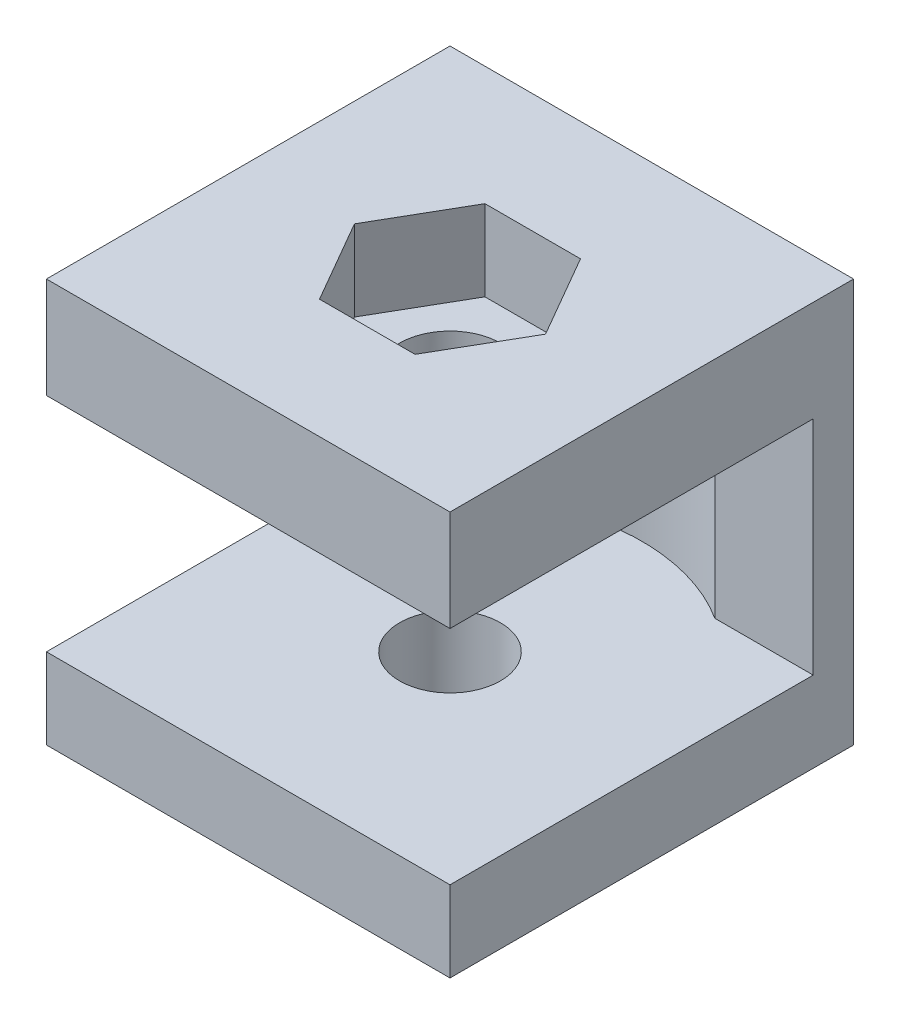
ISO-10303-21;
HEADER;
FILE_DESCRIPTION(('STEP AP214'),'2;1');
FILE_NAME('part.step','',(''),(''),'','','');
FILE_SCHEMA(('AUTOMOTIVE_DESIGN { 1 0 10303 214 1 1 1 1 }'));
ENDSEC;
DATA;
#1=APPLICATION_CONTEXT('core data for automotive mechanical design processes');
#2=APPLICATION_PROTOCOL_DEFINITION('international standard','automotive_design',2000,#1);
#3=PRODUCT_CONTEXT('',#1,'mechanical');
#4=PRODUCT('Part','Part','',(#3));
#5=PRODUCT_RELATED_PRODUCT_CATEGORY('part','',(#4));
#6=PRODUCT_DEFINITION_FORMATION('','',#4);
#7=PRODUCT_DEFINITION_CONTEXT('part definition',#1,'design');
#8=PRODUCT_DEFINITION('design','',#6,#7);
#9=PRODUCT_DEFINITION_SHAPE('','',#8);
#10=(LENGTH_UNIT() NAMED_UNIT(*) SI_UNIT(.MILLI.,.METRE.));
#11=(NAMED_UNIT(*) PLANE_ANGLE_UNIT() SI_UNIT($,.RADIAN.));
#12=(NAMED_UNIT(*) SI_UNIT($,.STERADIAN.) SOLID_ANGLE_UNIT());
#13=UNCERTAINTY_MEASURE_WITH_UNIT(LENGTH_MEASURE(1.E-05),#10,'distance_accuracy_value','');
#14=(GEOMETRIC_REPRESENTATION_CONTEXT(3) GLOBAL_UNCERTAINTY_ASSIGNED_CONTEXT((#13)) GLOBAL_UNIT_ASSIGNED_CONTEXT((#10,
#11,#12)) REPRESENTATION_CONTEXT('',''));
#15=CARTESIAN_POINT('',(0.,0.,0.));
#16=DIRECTION('',(0.,0.,1.));
#17=DIRECTION('',(1.,0.,0.));
#18=AXIS2_PLACEMENT_3D('',#15,#16,#17);
#19=CARTESIAN_POINT('',(0.,0.,2.));
#20=DIRECTION('',(0.,0.,-1.));
#21=DIRECTION('',(-1.,0.,0.));
#22=AXIS2_PLACEMENT_3D('',#19,#20,#21);
#23=PLANE('',#22);
#24=DIRECTION('',(1.,0.,0.));
#25=VECTOR('',#24,1.);
#26=CARTESIAN_POINT('',(-10.,5.,2.));
#27=LINE('',#26,#25);
#28=CARTESIAN_POINT('',(5.1234753829798,5.,2.));
#29=VERTEX_POINT('',#28);
#30=CARTESIAN_POINT('',(10.,5.,2.));
#31=VERTEX_POINT('',#30);
#32=EDGE_CURVE('E160',#29,#31,#27,.T.);
#33=ORIENTED_EDGE('',*,*,#32,.F.);
#34=DIRECTION('',(0.,-1.,0.));
#35=VECTOR('',#34,1.);
#36=CARTESIAN_POINT('',(5.1234753829798,5.,2.));
#37=LINE('',#36,#35);
#38=CARTESIAN_POINT('',(5.1234753829798,-6.,2.));
#39=VERTEX_POINT('',#38);
#40=EDGE_CURVE('E148',#29,#39,#37,.T.);
#41=ORIENTED_EDGE('',*,*,#40,.T.);
#42=DIRECTION('',(-1.,0.,0.));
#43=VECTOR('',#42,1.);
#44=CARTESIAN_POINT('',(10.,-6.,2.));
#45=LINE('',#44,#43);
#46=CARTESIAN_POINT('',(10.,-6.,2.));
#47=VERTEX_POINT('',#46);
#48=EDGE_CURVE('E158',#47,#39,#45,.T.);
#49=ORIENTED_EDGE('',*,*,#48,.F.);
#50=DIRECTION('',(0.,1.,0.));
#51=VECTOR('',#50,1.);
#52=CARTESIAN_POINT('',(10.,-10.,2.));
#53=LINE('',#52,#51);
#54=EDGE_CURVE('E206',#47,#31,#53,.T.);
#55=ORIENTED_EDGE('',*,*,#54,.T.);
#56=EDGE_LOOP('',(#33,#41,#49,#55));
#57=FACE_BOUND('',#56,.T.);
#58=ADVANCED_FACE('F33',(#57),#23,.F.);
#59=CARTESIAN_POINT('',(0.,-10.,10.));
#60=DIRECTION('',(0.,1.,0.));
#61=DIRECTION('',(0.,0.,1.));
#62=AXIS2_PLACEMENT_3D('',#59,#60,#61);
#63=CYLINDRICAL_SURFACE('',#62,2.5);
#64=CARTESIAN_POINT('',(0.,5.,10.));
#65=DIRECTION('',(0.,1.,0.));
#66=DIRECTION('',(-1.,0.,0.));
#67=AXIS2_PLACEMENT_3D('',#64,#65,#66);
#68=CIRCLE('',#67,2.5);
#69=CARTESIAN_POINT('',(-2.5,5.,10.));
#70=VERTEX_POINT('',#69);
#71=EDGE_CURVE('E173',#70,#70,#68,.T.);
#72=ORIENTED_EDGE('',*,*,#71,.F.);
#73=EDGE_LOOP('',(#72));
#74=FACE_BOUND('',#73,.T.);
#75=CARTESIAN_POINT('',(0.,6.,10.));
#76=DIRECTION('',(0.,1.,0.));
#77=DIRECTION('',(0.,0.,1.));
#78=AXIS2_PLACEMENT_3D('',#75,#76,#77);
#79=CIRCLE('',#78,2.5);
#80=CARTESIAN_POINT('',(0.,6.,12.5));
#81=VERTEX_POINT('',#80);
#82=EDGE_CURVE('E37',#81,#81,#79,.F.);
#83=ORIENTED_EDGE('',*,*,#82,.F.);
#84=EDGE_LOOP('',(#83));
#85=FACE_BOUND('',#84,.T.);
#86=ADVANCED_FACE('F304',(#74,#85),#63,.F.);
#87=CARTESIAN_POINT('',(-5.1234753829798,-6.,2.));
#88=VERTEX_POINT('',#87);
#89=CARTESIAN_POINT('',(-10.,-6.,2.));
#90=VERTEX_POINT('',#89);
#91=EDGE_CURVE('E168',#88,#90,#45,.T.);
#92=ORIENTED_EDGE('',*,*,#91,.F.);
#93=DIRECTION('',(0.,-1.,0.));
#94=VECTOR('',#93,1.);
#95=CARTESIAN_POINT('',(-5.1234753829798,5.,2.));
#96=LINE('',#95,#94);
#97=CARTESIAN_POINT('',(-5.1234753829798,5.,2.));
#98=VERTEX_POINT('',#97);
#99=EDGE_CURVE('E151',#88,#98,#96,.F.);
#100=ORIENTED_EDGE('',*,*,#99,.T.);
#101=CARTESIAN_POINT('',(-10.,5.,2.));
#102=VERTEX_POINT('',#101);
#103=EDGE_CURVE('E186',#102,#98,#27,.T.);
#104=ORIENTED_EDGE('',*,*,#103,.F.);
#105=DIRECTION('',(0.,-1.,0.));
#106=VECTOR('',#105,1.);
#107=CARTESIAN_POINT('',(-10.,-10.,2.));
#108=LINE('',#107,#106);
#109=EDGE_CURVE('E208',#102,#90,#108,.T.);
#110=ORIENTED_EDGE('',*,*,#109,.T.);
#111=EDGE_LOOP('',(#92,#100,#104,#110));
#112=FACE_BOUND('',#111,.T.);
#113=ADVANCED_FACE('F307',(#112),#23,.F.);
#114=CARTESIAN_POINT('',(10.,-10.,2.));
#115=DIRECTION('',(-1.,0.,0.));
#116=DIRECTION('',(0.,0.,1.));
#117=AXIS2_PLACEMENT_3D('',#114,#115,#116);
#118=PLANE('',#117);
#119=DIRECTION('',(0.,1.,0.));
#120=VECTOR('',#119,1.);
#121=CARTESIAN_POINT('',(10.,-10.,0.));
#122=LINE('',#121,#120);
#123=CARTESIAN_POINT('',(10.,-10.,0.));
#124=VERTEX_POINT('',#123);
#125=CARTESIAN_POINT('',(10.,10.,0.));
#126=VERTEX_POINT('',#125);
#127=EDGE_CURVE('E205',#124,#126,#122,.T.);
#128=ORIENTED_EDGE('',*,*,#127,.T.);
#129=DIRECTION('',(0.,0.,-1.));
#130=VECTOR('',#129,1.);
#131=CARTESIAN_POINT('',(10.,10.,2.));
#132=LINE('',#131,#130);
#133=CARTESIAN_POINT('',(10.,10.,20.));
#134=VERTEX_POINT('',#133);
#135=EDGE_CURVE('E11',#134,#126,#132,.T.);
#136=ORIENTED_EDGE('',*,*,#135,.F.);
#137=DIRECTION('',(0.,1.,0.));
#138=VECTOR('',#137,1.);
#139=CARTESIAN_POINT('',(10.,10.,20.));
#140=LINE('',#139,#138);
#141=CARTESIAN_POINT('',(10.,5.,20.));
#142=VERTEX_POINT('',#141);
#143=EDGE_CURVE('E188',#142,#134,#140,.T.);
#144=ORIENTED_EDGE('',*,*,#143,.F.);
#145=DIRECTION('',(0.,0.,-1.));
#146=VECTOR('',#145,1.);
#147=CARTESIAN_POINT('',(10.,5.,20.));
#148=LINE('',#147,#146);
#149=EDGE_CURVE('E194',#142,#31,#148,.T.);
#150=ORIENTED_EDGE('',*,*,#149,.T.);
#151=ORIENTED_EDGE('',*,*,#54,.F.);
#152=DIRECTION('',(0.,0.,-1.));
#153=VECTOR('',#152,1.);
#154=CARTESIAN_POINT('',(10.,-6.,20.));
#155=LINE('',#154,#153);
#156=CARTESIAN_POINT('',(10.,-6.,20.));
#157=VERTEX_POINT('',#156);
#158=EDGE_CURVE('E166',#157,#47,#155,.T.);
#159=ORIENTED_EDGE('',*,*,#158,.F.);
#160=DIRECTION('',(0.,1.,0.));
#161=VECTOR('',#160,1.);
#162=CARTESIAN_POINT('',(10.,-10.,20.));
#163=LINE('',#162,#161);
#164=CARTESIAN_POINT('',(10.,-10.,20.));
#165=VERTEX_POINT('',#164);
#166=EDGE_CURVE('E167',#165,#157,#163,.T.);
#167=ORIENTED_EDGE('',*,*,#166,.F.);
#168=DIRECTION('',(0.,0.,-1.));
#169=VECTOR('',#168,1.);
#170=CARTESIAN_POINT('',(10.,-10.,2.));
#171=LINE('',#170,#169);
#172=EDGE_CURVE('E212',#165,#124,#171,.T.);
#173=ORIENTED_EDGE('',*,*,#172,.T.);
#174=EDGE_LOOP('',(#128,#136,#144,#150,#151,#159,#167,#173));
#175=FACE_BOUND('',#174,.T.);
#176=ADVANCED_FACE('F35',(#175),#118,.F.);
#177=CARTESIAN_POINT('',(-10.,10.,2.));
#178=DIRECTION('',(0.,-1.,0.));
#179=DIRECTION('',(0.,0.,-1.));
#180=AXIS2_PLACEMENT_3D('',#177,#178,#179);
#181=PLANE('',#180);
#182=DIRECTION('',(-0.5,0.,-0.866025403784439));
#183=VECTOR('',#182,1.);
#184=CARTESIAN_POINT('',(4.73427220735493,10.,10.));
#185=LINE('',#184,#183);
#186=CARTESIAN_POINT('',(4.73427220735493,10.,10.));
#187=VERTEX_POINT('',#186);
#188=CARTESIAN_POINT('',(2.36713610367747,10.,5.9));
#189=VERTEX_POINT('',#188);
#190=EDGE_CURVE('E510',#187,#189,#185,.T.);
#191=ORIENTED_EDGE('',*,*,#190,.F.);
#192=DIRECTION('',(0.5,0.,-0.866025403784439));
#193=VECTOR('',#192,1.);
#194=CARTESIAN_POINT('',(2.36713610367747,10.,14.1));
#195=LINE('',#194,#193);
#196=CARTESIAN_POINT('',(2.36713610367747,10.,14.1));
#197=VERTEX_POINT('',#196);
#198=EDGE_CURVE('E58',#197,#187,#195,.T.);
#199=ORIENTED_EDGE('',*,*,#198,.F.);
#200=DIRECTION('',(1.,0.,0.));
#201=VECTOR('',#200,1.);
#202=CARTESIAN_POINT('',(-2.36713610367746,10.,14.1));
#203=LINE('',#202,#201);
#204=CARTESIAN_POINT('',(-2.36713610367746,10.,14.1));
#205=VERTEX_POINT('',#204);
#206=EDGE_CURVE('E526',#205,#197,#203,.T.);
#207=ORIENTED_EDGE('',*,*,#206,.F.);
#208=DIRECTION('',(0.5,0.,0.866025403784439));
#209=VECTOR('',#208,1.);
#210=CARTESIAN_POINT('',(-4.73427220735493,10.,10.));
#211=LINE('',#210,#209);
#212=CARTESIAN_POINT('',(-4.73427220735493,10.,10.));
#213=VERTEX_POINT('',#212);
#214=EDGE_CURVE('E523',#213,#205,#211,.T.);
#215=ORIENTED_EDGE('',*,*,#214,.F.);
#216=DIRECTION('',(-0.5,0.,0.866025403784439));
#217=VECTOR('',#216,1.);
#218=CARTESIAN_POINT('',(-2.36713610367746,10.,5.9));
#219=LINE('',#218,#217);
#220=CARTESIAN_POINT('',(-2.36713610367746,10.,5.9));
#221=VERTEX_POINT('',#220);
#222=EDGE_CURVE('E516',#221,#213,#219,.T.);
#223=ORIENTED_EDGE('',*,*,#222,.F.);
#224=DIRECTION('',(-1.,0.,0.));
#225=VECTOR('',#224,1.);
#226=CARTESIAN_POINT('',(2.36713610367747,10.,5.9));
#227=LINE('',#226,#225);
#228=EDGE_CURVE('E514',#189,#221,#227,.T.);
#229=ORIENTED_EDGE('',*,*,#228,.F.);
#230=EDGE_LOOP('',(#191,#199,#207,#215,#223,#229));
#231=FACE_BOUND('',#230,.T.);
#232=DIRECTION('',(-1.,0.,0.));
#233=VECTOR('',#232,1.);
#234=CARTESIAN_POINT('',(-10.,10.,0.));
#235=LINE('',#234,#233);
#236=CARTESIAN_POINT('',(-10.,10.,0.));
#237=VERTEX_POINT('',#236);
#238=EDGE_CURVE('E215',#126,#237,#235,.T.);
#239=ORIENTED_EDGE('',*,*,#238,.T.);
#240=DIRECTION('',(0.,0.,-1.));
#241=VECTOR('',#240,1.);
#242=CARTESIAN_POINT('',(-10.,10.,2.));
#243=LINE('',#242,#241);
#244=CARTESIAN_POINT('',(-10.,10.,20.));
#245=VERTEX_POINT('',#244);
#246=EDGE_CURVE('E42',#245,#237,#243,.T.);
#247=ORIENTED_EDGE('',*,*,#246,.F.);
#248=DIRECTION('',(-1.,0.,0.));
#249=VECTOR('',#248,1.);
#250=CARTESIAN_POINT('',(-10.,10.,20.));
#251=LINE('',#250,#249);
#252=EDGE_CURVE('E191',#134,#245,#251,.T.);
#253=ORIENTED_EDGE('',*,*,#252,.F.);
#254=ORIENTED_EDGE('',*,*,#135,.T.);
#255=EDGE_LOOP('',(#239,#247,#253,#254));
#256=FACE_BOUND('',#255,.T.);
#257=ADVANCED_FACE('F331',(#231,#256),#181,.F.);
#258=CARTESIAN_POINT('',(-10.,-10.,2.));
#259=DIRECTION('',(1.,0.,0.));
#260=DIRECTION('',(0.,0.,-1.));
#261=AXIS2_PLACEMENT_3D('',#258,#259,#260);
#262=PLANE('',#261);
#263=DIRECTION('',(0.,-1.,0.));
#264=VECTOR('',#263,1.);
#265=CARTESIAN_POINT('',(-10.,-10.,0.));
#266=LINE('',#265,#264);
#267=CARTESIAN_POINT('',(-10.,-10.,0.));
#268=VERTEX_POINT('',#267);
#269=EDGE_CURVE('E217',#237,#268,#266,.T.);
#270=ORIENTED_EDGE('',*,*,#269,.T.);
#271=DIRECTION('',(0.,0.,-1.));
#272=VECTOR('',#271,1.);
#273=CARTESIAN_POINT('',(-10.,-10.,2.));
#274=LINE('',#273,#272);
#275=CARTESIAN_POINT('',(-10.,-10.,20.));
#276=VERTEX_POINT('',#275);
#277=EDGE_CURVE('E222',#276,#268,#274,.T.);
#278=ORIENTED_EDGE('',*,*,#277,.F.);
#279=DIRECTION('',(0.,-1.,0.));
#280=VECTOR('',#279,1.);
#281=CARTESIAN_POINT('',(-10.,-10.,20.));
#282=LINE('',#281,#280);
#283=CARTESIAN_POINT('',(-10.,-6.,20.));
#284=VERTEX_POINT('',#283);
#285=EDGE_CURVE('E242',#284,#276,#282,.T.);
#286=ORIENTED_EDGE('',*,*,#285,.F.);
#287=DIRECTION('',(0.,0.,-1.));
#288=VECTOR('',#287,1.);
#289=CARTESIAN_POINT('',(-10.,-6.,20.));
#290=LINE('',#289,#288);
#291=EDGE_CURVE('E178',#284,#90,#290,.T.);
#292=ORIENTED_EDGE('',*,*,#291,.T.);
#293=ORIENTED_EDGE('',*,*,#109,.F.);
#294=DIRECTION('',(0.,0.,-1.));
#295=VECTOR('',#294,1.);
#296=CARTESIAN_POINT('',(-10.,5.,20.));
#297=LINE('',#296,#295);
#298=CARTESIAN_POINT('',(-10.,5.,20.));
#299=VERTEX_POINT('',#298);
#300=EDGE_CURVE('E199',#299,#102,#297,.T.);
#301=ORIENTED_EDGE('',*,*,#300,.F.);
#302=DIRECTION('',(0.,-1.,0.));
#303=VECTOR('',#302,1.);
#304=CARTESIAN_POINT('',(-10.,10.,20.));
#305=LINE('',#304,#303);
#306=EDGE_CURVE('E182',#245,#299,#305,.T.);
#307=ORIENTED_EDGE('',*,*,#306,.F.);
#308=ORIENTED_EDGE('',*,*,#246,.T.);
#309=EDGE_LOOP('',(#270,#278,#286,#292,#293,#301,#307,#308));
#310=FACE_BOUND('',#309,.T.);
#311=ADVANCED_FACE('F335',(#310),#262,.F.);
#312=CARTESIAN_POINT('',(-10.,-10.,2.));
#313=DIRECTION('',(0.,1.,0.));
#314=DIRECTION('',(0.,0.,1.));
#315=AXIS2_PLACEMENT_3D('',#312,#313,#314);
#316=PLANE('',#315);
#317=CARTESIAN_POINT('',(0.,-10.,10.));
#318=DIRECTION('',(0.,1.,0.));
#319=DIRECTION('',(0.,0.,1.));
#320=AXIS2_PLACEMENT_3D('',#317,#318,#319);
#321=CIRCLE('',#320,2.5);
#322=CARTESIAN_POINT('',(0.,-10.,12.5));
#323=VERTEX_POINT('',#322);
#324=EDGE_CURVE('E228',#323,#323,#321,.T.);
#325=ORIENTED_EDGE('',*,*,#324,.T.);
#326=EDGE_LOOP('',(#325));
#327=FACE_BOUND('',#326,.T.);
#328=DIRECTION('',(1.,0.,0.));
#329=VECTOR('',#328,1.);
#330=CARTESIAN_POINT('',(-10.,-10.,0.));
#331=LINE('',#330,#329);
#332=EDGE_CURVE('E209',#268,#124,#331,.T.);
#333=ORIENTED_EDGE('',*,*,#332,.T.);
#334=ORIENTED_EDGE('',*,*,#172,.F.);
#335=DIRECTION('',(1.,0.,0.));
#336=VECTOR('',#335,1.);
#337=CARTESIAN_POINT('',(10.,-10.,20.));
#338=LINE('',#337,#336);
#339=EDGE_CURVE('E176',#276,#165,#338,.T.);
#340=ORIENTED_EDGE('',*,*,#339,.F.);
#341=ORIENTED_EDGE('',*,*,#277,.T.);
#342=EDGE_LOOP('',(#333,#334,#340,#341));
#343=FACE_BOUND('',#342,.T.);
#344=ADVANCED_FACE('F338',(#327,#343),#316,.F.);
#345=CARTESIAN_POINT('',(0.,0.,0.));
#346=DIRECTION('',(0.,0.,-1.));
#347=DIRECTION('',(-1.,0.,0.));
#348=AXIS2_PLACEMENT_3D('',#345,#346,#347);
#349=PLANE('',#348);
#350=CARTESIAN_POINT('',(0.,0.,0.));
#351=DIRECTION('',(0.,0.,1.));
#352=DIRECTION('',(1.,0.,0.));
#353=AXIS2_PLACEMENT_3D('',#350,#351,#352);
#354=CIRCLE('',#353,1.75);
#355=CARTESIAN_POINT('',(1.75,0.,0.));
#356=VERTEX_POINT('',#355);
#357=EDGE_CURVE('E202',#356,#356,#354,.T.);
#358=ORIENTED_EDGE('',*,*,#357,.T.);
#359=EDGE_LOOP('',(#358));
#360=FACE_BOUND('',#359,.T.);
#361=ORIENTED_EDGE('',*,*,#127,.F.);
#362=ORIENTED_EDGE('',*,*,#332,.F.);
#363=ORIENTED_EDGE('',*,*,#269,.F.);
#364=ORIENTED_EDGE('',*,*,#238,.F.);
#365=EDGE_LOOP('',(#361,#362,#363,#364));
#366=FACE_BOUND('',#365,.T.);
#367=ADVANCED_FACE('F320',(#360,#366),#349,.T.);
#368=CARTESIAN_POINT('',(0.,0.,0.));
#369=DIRECTION('',(0.,0.,1.));
#370=DIRECTION('',(1.,0.,0.));
#371=AXIS2_PLACEMENT_3D('',#368,#369,#370);
#372=CYLINDRICAL_SURFACE('',#371,1.75);
#373=CARTESIAN_POINT('',(1.75,0.,0.66257530150845));
#374=CARTESIAN_POINT('',(1.74999623220849,0.0973992990408209,0.662573433377604));
#375=CARTESIAN_POINT('',(1.74184102840947,0.19484785294214,0.661034789893482));
#376=CARTESIAN_POINT('',(1.7094563799509,0.386999395994813,0.655053783929409));
#377=CARTESIAN_POINT('',(1.68521310323896,0.481699949305023,0.650608922817402));
#378=CARTESIAN_POINT('',(1.62142018446091,0.665547326706458,0.639335590529856));
#379=CARTESIAN_POINT('',(1.58188455731664,0.754699149424011,0.632509302411816));
#380=CARTESIAN_POINT('',(1.48866598605152,0.925098267008444,0.617244849503819));
#381=CARTESIAN_POINT('',(1.43498422601556,1.00634622267996,0.608806819639008));
#382=CARTESIAN_POINT('',(1.31430957437895,1.15961422830781,0.591156377114761));
#383=CARTESIAN_POINT('',(1.24717959692718,1.23152551318474,0.581936605460816));
#384=CARTESIAN_POINT('',(1.10181036515984,1.36313172007598,0.563826571966348));
#385=CARTESIAN_POINT('',(1.02357039415572,1.42282585337375,0.554936331430062));
#386=CARTESIAN_POINT('',(0.85748926558963,1.52871866655231,0.538408364963862));
#387=CARTESIAN_POINT('',(0.769581813216118,1.57481501027697,0.530780317566186));
#388=CARTESIAN_POINT('',(0.587106497676677,1.65154467633781,0.517718506249797));
#389=CARTESIAN_POINT('',(0.492539163717247,1.68217922572047,0.512284568213628));
#390=CARTESIAN_POINT('',(0.300555090734633,1.72677996183346,0.504275206993335));
#391=CARTESIAN_POINT('',(0.203182258196524,1.74092941143396,0.501668378154));
#392=CARTESIAN_POINT('',(0.00741218452522141,1.75272912668234,0.499498763447316));
#393=CARTESIAN_POINT('',(-0.0909849716179178,1.75038075046119,0.499935727009428));
#394=CARTESIAN_POINT('',(-0.284754386185304,1.72939241762022,0.503779868073802));
#395=CARTESIAN_POINT('',(-0.3801488332116,1.71094977235138,0.507151071293143));
#396=CARTESIAN_POINT('',(-0.56646549184599,1.65860825796605,0.516444598035701));
#397=CARTESIAN_POINT('',(-0.657387544566736,1.62470884016728,0.522367012121019));
#398=CARTESIAN_POINT('',(-0.832753181774179,1.54222672964522,0.536157835820039));
#399=CARTESIAN_POINT('',(-0.917158623417399,1.4935647621454,0.544036709087695));
#400=CARTESIAN_POINT('',(-1.07667964463152,1.38299724157549,0.560868452159825));
#401=CARTESIAN_POINT('',(-1.15179430998452,1.32109038683414,0.569821427486094));
#402=CARTESIAN_POINT('',(-1.29177008670047,1.18470191740536,0.587965475313633));
#403=CARTESIAN_POINT('',(-1.35646293273775,1.11004770502819,0.597158110464606));
#404=CARTESIAN_POINT('',(-1.47243448565902,0.950859715548552,0.614618466271964));
#405=CARTESIAN_POINT('',(-1.52371300951477,0.866325803667851,0.62288617430754));
#406=CARTESIAN_POINT('',(-1.61144579517849,0.689559567944131,0.637562622261527));
#407=CARTESIAN_POINT('',(-1.64787630010941,0.597315189248504,0.643968378391344));
#408=CARTESIAN_POINT('',(-1.70467519314325,0.407870607320929,0.654149403364964));
#409=CARTESIAN_POINT('',(-1.72504533309926,0.310670945839446,0.657924959103911));
#410=CARTESIAN_POINT('',(-1.74890103879325,0.115590314622451,0.66236153715483));
#411=CARTESIAN_POINT('',(-1.75262803868117,0.0177398517096092,0.663067090650959));
#412=CARTESIAN_POINT('',(-1.74373823279406,-0.177185440443587,0.661402851983836));
#413=CARTESIAN_POINT('',(-1.73112220567213,-0.274260306415052,0.659033206336475));
#414=CARTESIAN_POINT('',(-1.6901115040537,-0.464089525762903,0.651526993674159));
#415=CARTESIAN_POINT('',(-1.66184278817828,-0.556872043324447,0.646412524484684));
#416=CARTESIAN_POINT('',(-1.5904625447016,-0.736383547024237,0.634011891852634));
#417=CARTESIAN_POINT('',(-1.54734995646197,-0.823112100056147,0.626725573230021));
#418=CARTESIAN_POINT('',(-1.44694776863841,-0.989119203198677,0.61070047656171));
#419=CARTESIAN_POINT('',(-1.38950528745253,-1.06830378430387,0.601946393069288));
#420=CARTESIAN_POINT('',(-1.26228065382657,-1.21599727332881,0.584015461861776));
#421=CARTESIAN_POINT('',(-1.19249743219131,-1.2845052552654,0.574838577566434));
#422=CARTESIAN_POINT('',(-1.04149530684682,-1.40979947460517,0.556953317335429));
#423=CARTESIAN_POINT('',(-0.960140823561461,-1.46642356022879,0.548252488283825));
#424=CARTESIAN_POINT('',(-0.788933385413953,-1.56519967025242,0.53242565771868));
#425=CARTESIAN_POINT('',(-0.699080749815658,-1.60735223805215,0.525299597076795));
#426=CARTESIAN_POINT('',(-0.51388115951197,-1.67574442102738,0.513457729743675));
#427=CARTESIAN_POINT('',(-0.418564741248215,-1.70206452640526,0.508729751106474));
#428=CARTESIAN_POINT('',(-0.224769199134576,-1.73830194267835,0.502164913377099));
#429=CARTESIAN_POINT('',(-0.126290397015052,-1.74822091681413,0.500327761126809));
#430=CARTESIAN_POINT('',(0.0694777982949662,-1.75131825504182,0.499757123953196));
#431=CARTESIAN_POINT('',(0.166763264846646,-1.74474181708644,0.500978179548137));
#432=CARTESIAN_POINT('',(0.358818011923729,-1.7155709320034,0.506292571556378));
#433=CARTESIAN_POINT('',(0.453587314779695,-1.69297662708117,0.51038588247001));
#434=CARTESIAN_POINT('',(0.637795891640937,-1.63251321922082,0.520985208348054));
#435=CARTESIAN_POINT('',(0.727243694113592,-1.5946693565223,0.527487235109412));
#436=CARTESIAN_POINT('',(0.898556753537189,-1.50481010052252,0.542199167154237));
#437=CARTESIAN_POINT('',(0.980421525849583,-1.45279380228386,0.550409181488094));
#438=CARTESIAN_POINT('',(1.13546881326901,-1.33521800958212,0.5677739178525));
#439=CARTESIAN_POINT('',(1.20851540627591,-1.26948095364387,0.57694014721015));
#440=CARTESIAN_POINT('',(1.34262589185702,-1.12669893885866,0.595110466762734));
#441=CARTESIAN_POINT('',(1.40368696552685,-1.04965132728351,0.604114518363499));
#442=CARTESIAN_POINT('',(1.51260093339117,-0.885617563756835,0.621028217423808));
#443=CARTESIAN_POINT('',(1.56033172316865,-0.798549232600897,0.628927436490987));
#444=CARTESIAN_POINT('',(1.64041294290002,-0.617513481582978,0.642612038702116));
#445=CARTESIAN_POINT('',(1.67277803215517,-0.523552736501267,0.648399435357762));
#446=CARTESIAN_POINT('',(1.71455609216357,-0.357749345345729,0.655985550320529));
#447=CARTESIAN_POINT('',(1.72782502358126,-0.286883297800175,0.658442189376621));
#448=CARTESIAN_POINT('',(1.74554825793157,-0.144020458609727,0.66173773500809));
#449=CARTESIAN_POINT('',(1.75000278616245,-0.0720236959135958,0.662576682932027));
#450=CARTESIAN_POINT('',(1.75,0.,0.66257530150845));
#451=B_SPLINE_CURVE_WITH_KNOTS('',3,(#373,#374,#375,#376,#377,#378,#379,#380,#381,#382,#383,
#384,#385,#386,#387,#388,#389,#390,#391,#392,#393,#394,#395,#396,#397,#398,#399,#400,#401,#402,
#403,#404,#405,#406,#407,#408,#409,#410,#411,#412,#413,#414,#415,#416,#417,#418,#419,#420,#421,
#422,#423,#424,#425,#426,#427,#428,#429,#430,#431,#432,#433,#434,#435,#436,#437,#438,#439,#440,
#441,#442,#443,#444,#445,#446,#447,#448,#449,#450),.UNSPECIFIED.,.T.,.F.,(4,2,2,2,2,2,2,2,2,2,2,
2,2,2,2,2,2,2,2,2,2,2,2,2,2,2,2,2,2,2,2,2,2,2,2,2,2,2,4),(0.,0.291934358602887,
0.584120039543988,0.876038574242155,1.16793268201063,1.46296932864356,1.75802501628877,
2.05524771572823,2.35244682389336,2.64630949134535,2.94014796777273,3.2304338851434,
3.52073010784371,3.81261367411772,4.10452593909714,4.40075990020901,4.69699790299752,
4.99370804419395,5.29038581598125,5.58274554211787,5.87509133947423,6.16511809203133,
6.45516557215574,6.74845076438746,7.04176137915214,7.33884571560795,7.63591889544509,
7.93146874079074,8.22698861255469,8.51814180525255,8.80929241314662,9.09996309086742,
9.39065233282397,9.68536680663061,9.98015051223902,10.2775519146626,10.5746690149585,
10.7905507423734,11.0064269517282),.UNSPECIFIED.);
#452=CARTESIAN_POINT('',(1.75,0.,0.66257530150845));
#453=VERTEX_POINT('',#452);
#454=EDGE_CURVE('E258',#453,#453,#451,.T.);
#455=ORIENTED_EDGE('',*,*,#454,.T.);
#456=EDGE_LOOP('',(#455));
#457=FACE_BOUND('',#456,.T.);
#458=ORIENTED_EDGE('',*,*,#357,.F.);
#459=EDGE_LOOP('',(#458));
#460=FACE_BOUND('',#459,.T.);
#461=ADVANCED_FACE('F268',(#457,#460),#372,.F.);
#462=CARTESIAN_POINT('',(-10.,5.,20.));
#463=DIRECTION('',(0.,1.,0.));
#464=DIRECTION('',(-1.,0.,0.));
#465=AXIS2_PLACEMENT_3D('',#462,#463,#464);
#466=PLANE('',#465);
#467=ORIENTED_EDGE('',*,*,#103,.T.);
#468=CARTESIAN_POINT('',(0.,5.,10.));
#469=DIRECTION('',(0.,-1.,0.));
#470=DIRECTION('',(0.,0.,-1.));
#471=AXIS2_PLACEMENT_3D('',#468,#469,#470);
#472=CIRCLE('',#471,9.5);
#473=EDGE_CURVE('E153',#98,#29,#472,.T.);
#474=ORIENTED_EDGE('',*,*,#473,.T.);
#475=ORIENTED_EDGE('',*,*,#32,.T.);
#476=ORIENTED_EDGE('',*,*,#149,.F.);
#477=DIRECTION('',(1.,0.,0.));
#478=VECTOR('',#477,1.);
#479=CARTESIAN_POINT('',(-10.,5.,20.));
#480=LINE('',#479,#478);
#481=EDGE_CURVE('E185',#299,#142,#480,.T.);
#482=ORIENTED_EDGE('',*,*,#481,.F.);
#483=ORIENTED_EDGE('',*,*,#300,.T.);
#484=EDGE_LOOP('',(#467,#474,#475,#476,#482,#483));
#485=FACE_BOUND('',#484,.T.);
#486=ORIENTED_EDGE('',*,*,#71,.T.);
#487=EDGE_LOOP('',(#486));
#488=FACE_BOUND('',#487,.T.);
#489=ADVANCED_FACE('F256',(#485,#488),#466,.F.);
#490=CARTESIAN_POINT('',(0.,0.,20.));
#491=DIRECTION('',(0.,0.,1.));
#492=DIRECTION('',(1.,0.,0.));
#493=AXIS2_PLACEMENT_3D('',#490,#491,#492);
#494=PLANE('',#493);
#495=ORIENTED_EDGE('',*,*,#306,.T.);
#496=ORIENTED_EDGE('',*,*,#481,.T.);
#497=ORIENTED_EDGE('',*,*,#143,.T.);
#498=ORIENTED_EDGE('',*,*,#252,.T.);
#499=EDGE_LOOP('',(#495,#496,#497,#498));
#500=FACE_BOUND('',#499,.T.);
#501=ADVANCED_FACE('F313',(#500),#494,.T.);
#502=CARTESIAN_POINT('',(10.,-6.,20.));
#503=DIRECTION('',(0.,-1.,0.));
#504=DIRECTION('',(1.,0.,0.));
#505=AXIS2_PLACEMENT_3D('',#502,#503,#504);
#506=PLANE('',#505);
#507=ORIENTED_EDGE('',*,*,#48,.T.);
#508=CARTESIAN_POINT('',(0.,-6.,10.));
#509=DIRECTION('',(0.,-1.,0.));
#510=DIRECTION('',(0.,0.,-1.));
#511=AXIS2_PLACEMENT_3D('',#508,#509,#510);
#512=CIRCLE('',#511,9.5);
#513=EDGE_CURVE('E50',#88,#39,#512,.T.);
#514=ORIENTED_EDGE('',*,*,#513,.F.);
#515=ORIENTED_EDGE('',*,*,#91,.T.);
#516=ORIENTED_EDGE('',*,*,#291,.F.);
#517=DIRECTION('',(-1.,0.,0.));
#518=VECTOR('',#517,1.);
#519=CARTESIAN_POINT('',(10.,-6.,20.));
#520=LINE('',#519,#518);
#521=EDGE_CURVE('E171',#157,#284,#520,.T.);
#522=ORIENTED_EDGE('',*,*,#521,.F.);
#523=ORIENTED_EDGE('',*,*,#158,.T.);
#524=EDGE_LOOP('',(#507,#514,#515,#516,#522,#523));
#525=FACE_BOUND('',#524,.T.);
#526=CARTESIAN_POINT('',(0.,-6.,10.));
#527=DIRECTION('',(0.,-1.,0.));
#528=DIRECTION('',(1.,0.,0.));
#529=AXIS2_PLACEMENT_3D('',#526,#527,#528);
#530=CIRCLE('',#529,2.5);
#531=CARTESIAN_POINT('',(2.5,-6.,10.));
#532=VERTEX_POINT('',#531);
#533=EDGE_CURVE('E226',#532,#532,#530,.T.);
#534=ORIENTED_EDGE('',*,*,#533,.T.);
#535=EDGE_LOOP('',(#534));
#536=FACE_BOUND('',#535,.T.);
#537=ADVANCED_FACE('F163',(#525,#536),#506,.F.);
#538=CARTESIAN_POINT('',(0.,0.,20.));
#539=DIRECTION('',(0.,0.,1.));
#540=DIRECTION('',(1.,0.,0.));
#541=AXIS2_PLACEMENT_3D('',#538,#539,#540);
#542=PLANE('',#541);
#543=ORIENTED_EDGE('',*,*,#166,.T.);
#544=ORIENTED_EDGE('',*,*,#521,.T.);
#545=ORIENTED_EDGE('',*,*,#285,.T.);
#546=ORIENTED_EDGE('',*,*,#339,.T.);
#547=EDGE_LOOP('',(#543,#544,#545,#546));
#548=FACE_BOUND('',#547,.T.);
#549=ADVANCED_FACE('F249',(#548),#542,.T.);
#550=ORIENTED_EDGE('',*,*,#324,.F.);
#551=EDGE_LOOP('',(#550));
#552=FACE_BOUND('',#551,.T.);
#553=ORIENTED_EDGE('',*,*,#533,.F.);
#554=EDGE_LOOP('',(#553));
#555=FACE_BOUND('',#554,.T.);
#556=ADVANCED_FACE('F281',(#552,#555),#63,.F.);
#557=CARTESIAN_POINT('',(0.,6.,0.));
#558=DIRECTION('',(0.,1.,0.));
#559=DIRECTION('',(0.,0.,1.));
#560=AXIS2_PLACEMENT_3D('',#557,#558,#559);
#561=PLANE('',#560);
#562=DIRECTION('',(0.5,0.,-0.866025403784439));
#563=VECTOR('',#562,1.);
#564=CARTESIAN_POINT('',(2.36713610367747,6.,14.1));
#565=LINE('',#564,#563);
#566=CARTESIAN_POINT('',(2.36713610367747,6.,14.1));
#567=VERTEX_POINT('',#566);
#568=CARTESIAN_POINT('',(4.73427220735493,6.,10.));
#569=VERTEX_POINT('',#568);
#570=EDGE_CURVE('E529',#567,#569,#565,.T.);
#571=ORIENTED_EDGE('',*,*,#570,.T.);
#572=DIRECTION('',(-0.5,0.,-0.866025403784439));
#573=VECTOR('',#572,1.);
#574=CARTESIAN_POINT('',(4.73427220735493,6.,10.));
#575=LINE('',#574,#573);
#576=CARTESIAN_POINT('',(2.36713610367747,6.,5.9));
#577=VERTEX_POINT('',#576);
#578=EDGE_CURVE('E553',#569,#577,#575,.T.);
#579=ORIENTED_EDGE('',*,*,#578,.T.);
#580=DIRECTION('',(-1.,0.,0.));
#581=VECTOR('',#580,1.);
#582=CARTESIAN_POINT('',(2.36713610367747,6.,5.9));
#583=LINE('',#582,#581);
#584=CARTESIAN_POINT('',(-2.36713610367746,6.,5.9));
#585=VERTEX_POINT('',#584);
#586=EDGE_CURVE('E550',#577,#585,#583,.T.);
#587=ORIENTED_EDGE('',*,*,#586,.T.);
#588=DIRECTION('',(-0.5,0.,0.866025403784439));
#589=VECTOR('',#588,1.);
#590=CARTESIAN_POINT('',(-2.36713610367746,6.,5.9));
#591=LINE('',#590,#589);
#592=CARTESIAN_POINT('',(-4.73427220735493,6.,10.));
#593=VERTEX_POINT('',#592);
#594=EDGE_CURVE('E545',#585,#593,#591,.T.);
#595=ORIENTED_EDGE('',*,*,#594,.T.);
#596=DIRECTION('',(0.5,0.,0.866025403784439));
#597=VECTOR('',#596,1.);
#598=CARTESIAN_POINT('',(-4.73427220735493,6.,10.));
#599=LINE('',#598,#597);
#600=CARTESIAN_POINT('',(-2.36713610367746,6.,14.1));
#601=VERTEX_POINT('',#600);
#602=EDGE_CURVE('E541',#593,#601,#599,.T.);
#603=ORIENTED_EDGE('',*,*,#602,.T.);
#604=DIRECTION('',(1.,0.,0.));
#605=VECTOR('',#604,1.);
#606=CARTESIAN_POINT('',(-2.36713610367746,6.,14.1));
#607=LINE('',#606,#605);
#608=EDGE_CURVE('E538',#601,#567,#607,.T.);
#609=ORIENTED_EDGE('',*,*,#608,.T.);
#610=EDGE_LOOP('',(#571,#579,#587,#595,#603,#609));
#611=FACE_BOUND('',#610,.T.);
#612=ORIENTED_EDGE('',*,*,#82,.T.);
#613=EDGE_LOOP('',(#612));
#614=FACE_BOUND('',#613,.T.);
#615=ADVANCED_FACE('F277',(#611,#614),#561,.T.);
#616=CARTESIAN_POINT('',(2.36713610367747,6.,14.1));
#617=DIRECTION('',(0.866025403784439,0.,0.5));
#618=DIRECTION('',(0.5,0.,-0.866025403784439));
#619=AXIS2_PLACEMENT_3D('',#616,#617,#618);
#620=PLANE('',#619);
#621=ORIENTED_EDGE('',*,*,#198,.T.);
#622=DIRECTION('',(0.,1.,0.));
#623=VECTOR('',#622,1.);
#624=CARTESIAN_POINT('',(4.73427220735493,6.,10.));
#625=LINE('',#624,#623);
#626=EDGE_CURVE('E239',#569,#187,#625,.T.);
#627=ORIENTED_EDGE('',*,*,#626,.F.);
#628=ORIENTED_EDGE('',*,*,#570,.F.);
#629=DIRECTION('',(0.,1.,0.));
#630=VECTOR('',#629,1.);
#631=CARTESIAN_POINT('',(2.36713610367747,6.,14.1));
#632=LINE('',#631,#630);
#633=EDGE_CURVE('E237',#567,#197,#632,.T.);
#634=ORIENTED_EDGE('',*,*,#633,.T.);
#635=EDGE_LOOP('',(#621,#627,#628,#634));
#636=FACE_BOUND('',#635,.T.);
#637=ADVANCED_FACE('F280',(#636),#620,.F.);
#638=CARTESIAN_POINT('',(-2.36713610367746,6.,14.1));
#639=DIRECTION('',(0.,0.,1.));
#640=DIRECTION('',(1.,0.,0.));
#641=AXIS2_PLACEMENT_3D('',#638,#639,#640);
#642=PLANE('',#641);
#643=ORIENTED_EDGE('',*,*,#206,.T.);
#644=ORIENTED_EDGE('',*,*,#633,.F.);
#645=ORIENTED_EDGE('',*,*,#608,.F.);
#646=DIRECTION('',(0.,1.,0.));
#647=VECTOR('',#646,1.);
#648=CARTESIAN_POINT('',(-2.36713610367746,6.,14.1));
#649=LINE('',#648,#647);
#650=EDGE_CURVE('E531',#601,#205,#649,.T.);
#651=ORIENTED_EDGE('',*,*,#650,.T.);
#652=EDGE_LOOP('',(#643,#644,#645,#651));
#653=FACE_BOUND('',#652,.T.);
#654=ADVANCED_FACE('F283',(#653),#642,.F.);
#655=CARTESIAN_POINT('',(-4.73427220735493,6.,10.));
#656=DIRECTION('',(-0.866025403784439,0.,0.5));
#657=DIRECTION('',(0.5,0.,0.866025403784439));
#658=AXIS2_PLACEMENT_3D('',#655,#656,#657);
#659=PLANE('',#658);
#660=ORIENTED_EDGE('',*,*,#214,.T.);
#661=ORIENTED_EDGE('',*,*,#650,.F.);
#662=ORIENTED_EDGE('',*,*,#602,.F.);
#663=DIRECTION('',(0.,1.,0.));
#664=VECTOR('',#663,1.);
#665=CARTESIAN_POINT('',(-4.73427220735493,6.,10.));
#666=LINE('',#665,#664);
#667=EDGE_CURVE('E533',#593,#213,#666,.T.);
#668=ORIENTED_EDGE('',*,*,#667,.T.);
#669=EDGE_LOOP('',(#660,#661,#662,#668));
#670=FACE_BOUND('',#669,.T.);
#671=ADVANCED_FACE('F286',(#670),#659,.F.);
#672=CARTESIAN_POINT('',(-2.36713610367746,6.,5.9));
#673=DIRECTION('',(-0.866025403784439,0.,-0.5));
#674=DIRECTION('',(-0.5,0.,0.866025403784439));
#675=AXIS2_PLACEMENT_3D('',#672,#673,#674);
#676=PLANE('',#675);
#677=ORIENTED_EDGE('',*,*,#222,.T.);
#678=ORIENTED_EDGE('',*,*,#667,.F.);
#679=ORIENTED_EDGE('',*,*,#594,.F.);
#680=DIRECTION('',(0.,1.,0.));
#681=VECTOR('',#680,1.);
#682=CARTESIAN_POINT('',(-2.36713610367746,6.,5.9));
#683=LINE('',#682,#681);
#684=EDGE_CURVE('E535',#585,#221,#683,.T.);
#685=ORIENTED_EDGE('',*,*,#684,.T.);
#686=EDGE_LOOP('',(#677,#678,#679,#685));
#687=FACE_BOUND('',#686,.T.);
#688=ADVANCED_FACE('F290',(#687),#676,.F.);
#689=CARTESIAN_POINT('',(2.36713610367747,6.,5.9));
#690=DIRECTION('',(0.,0.,-1.));
#691=DIRECTION('',(-1.,0.,0.));
#692=AXIS2_PLACEMENT_3D('',#689,#690,#691);
#693=PLANE('',#692);
#694=ORIENTED_EDGE('',*,*,#228,.T.);
#695=ORIENTED_EDGE('',*,*,#684,.F.);
#696=ORIENTED_EDGE('',*,*,#586,.F.);
#697=DIRECTION('',(0.,1.,0.));
#698=VECTOR('',#697,1.);
#699=CARTESIAN_POINT('',(2.36713610367747,6.,5.9));
#700=LINE('',#699,#698);
#701=EDGE_CURVE('E536',#577,#189,#700,.T.);
#702=ORIENTED_EDGE('',*,*,#701,.T.);
#703=EDGE_LOOP('',(#694,#695,#696,#702));
#704=FACE_BOUND('',#703,.T.);
#705=ADVANCED_FACE('F294',(#704),#693,.F.);
#706=CARTESIAN_POINT('',(4.73427220735493,6.,10.));
#707=DIRECTION('',(0.866025403784439,0.,-0.5));
#708=DIRECTION('',(-0.5,0.,-0.866025403784439));
#709=AXIS2_PLACEMENT_3D('',#706,#707,#708);
#710=PLANE('',#709);
#711=ORIENTED_EDGE('',*,*,#190,.T.);
#712=ORIENTED_EDGE('',*,*,#701,.F.);
#713=ORIENTED_EDGE('',*,*,#578,.F.);
#714=ORIENTED_EDGE('',*,*,#626,.T.);
#715=EDGE_LOOP('',(#711,#712,#713,#714));
#716=FACE_BOUND('',#715,.T.);
#717=ADVANCED_FACE('F275',(#716),#710,.F.);
#718=CARTESIAN_POINT('',(0.,5.,10.));
#719=DIRECTION('',(0.,-1.,0.));
#720=DIRECTION('',(0.,0.,-1.));
#721=AXIS2_PLACEMENT_3D('',#718,#719,#720);
#722=CYLINDRICAL_SURFACE('',#721,9.5);
#723=ORIENTED_EDGE('',*,*,#454,.F.);
#724=EDGE_LOOP('',(#723));
#725=FACE_BOUND('',#724,.T.);
#726=ORIENTED_EDGE('',*,*,#473,.F.);
#727=ORIENTED_EDGE('',*,*,#99,.F.);
#728=ORIENTED_EDGE('',*,*,#513,.T.);
#729=ORIENTED_EDGE('',*,*,#40,.F.);
#730=EDGE_LOOP('',(#726,#727,#728,#729));
#731=FACE_BOUND('',#730,.T.);
#732=ADVANCED_FACE('F147',(#725,#731),#722,.F.);
#733=CLOSED_SHELL('',(#58,#86,#113,#176,#257,#311,#344,#367,#461,#489,#501,#537,#549,#556,#615,
#637,#654,#671,#688,#705,#717,#732));
#734=MANIFOLD_SOLID_BREP('B2',#733);
#735=ADVANCED_BREP_SHAPE_REPRESENTATION('',(#18,#734),#14);
#736=SHAPE_DEFINITION_REPRESENTATION(#9,#735);
ENDSEC;
END-ISO-10303-21;
